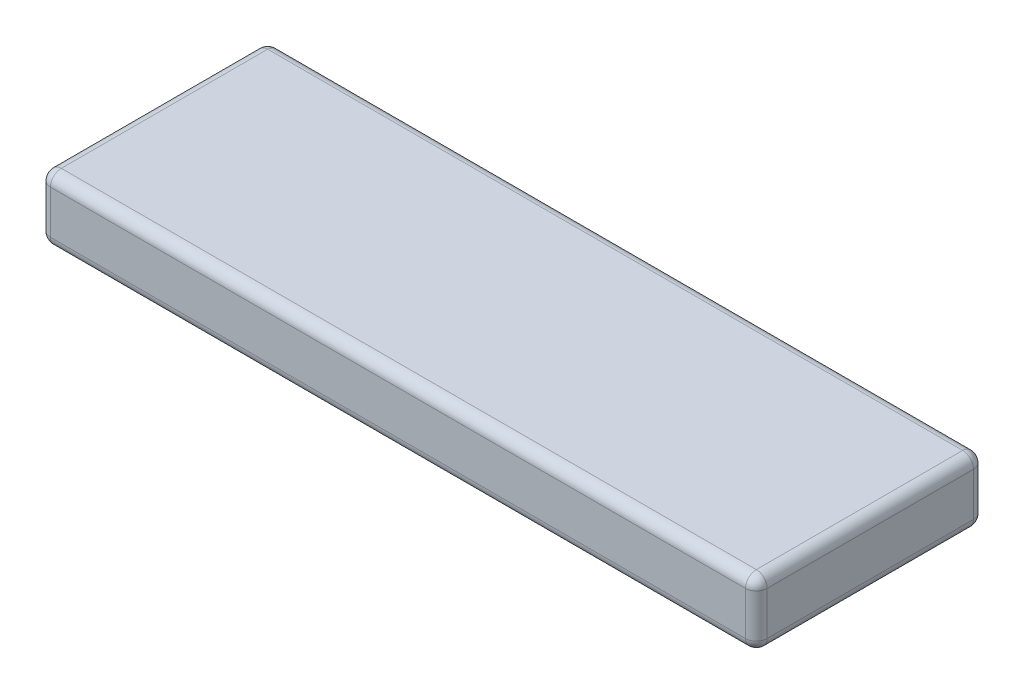
ISO-10303-21;
HEADER;
FILE_DESCRIPTION(('STEP AP214'),'2;1');
FILE_NAME('part.step','',(''),(''),'','','');
FILE_SCHEMA(('AUTOMOTIVE_DESIGN { 1 0 10303 214 1 1 1 1 }'));
ENDSEC;
DATA;
#1=APPLICATION_CONTEXT('core data for automotive mechanical design processes');
#2=APPLICATION_PROTOCOL_DEFINITION('international standard','automotive_design',2000,#1);
#3=PRODUCT_CONTEXT('',#1,'mechanical');
#4=PRODUCT('Part','Part','',(#3));
#5=PRODUCT_RELATED_PRODUCT_CATEGORY('part','',(#4));
#6=PRODUCT_DEFINITION_FORMATION('','',#4);
#7=PRODUCT_DEFINITION_CONTEXT('part definition',#1,'design');
#8=PRODUCT_DEFINITION('design','',#6,#7);
#9=PRODUCT_DEFINITION_SHAPE('','',#8);
#10=(LENGTH_UNIT() NAMED_UNIT(*) SI_UNIT(.MILLI.,.METRE.));
#11=(NAMED_UNIT(*) PLANE_ANGLE_UNIT() SI_UNIT($,.RADIAN.));
#12=(NAMED_UNIT(*) SI_UNIT($,.STERADIAN.) SOLID_ANGLE_UNIT());
#13=UNCERTAINTY_MEASURE_WITH_UNIT(LENGTH_MEASURE(1.E-05),#10,'distance_accuracy_value','');
#14=(GEOMETRIC_REPRESENTATION_CONTEXT(3) GLOBAL_UNCERTAINTY_ASSIGNED_CONTEXT((#13)) GLOBAL_UNIT_ASSIGNED_CONTEXT((#10,
#11,#12)) REPRESENTATION_CONTEXT('',''));
#15=CARTESIAN_POINT('',(0.,0.,0.));
#16=DIRECTION('',(0.,0.,1.));
#17=DIRECTION('',(1.,0.,0.));
#18=AXIS2_PLACEMENT_3D('',#15,#16,#17);
#19=CARTESIAN_POINT('',(66.,12.,21.));
#20=DIRECTION('',(-1.,0.,0.));
#21=DIRECTION('',(0.,0.,1.));
#22=AXIS2_PLACEMENT_3D('',#19,#20,#21);
#23=PLANE('',#22);
#24=DIRECTION('',(0.,-1.,0.));
#25=VECTOR('',#24,1.);
#26=CARTESIAN_POINT('',(66.,12.,19.));
#27=LINE('',#26,#25);
#28=CARTESIAN_POINT('',(66.,10.,19.));
#29=VERTEX_POINT('',#28);
#30=CARTESIAN_POINT('',(66.,2.,19.));
#31=VERTEX_POINT('',#30);
#32=EDGE_CURVE('E281',#29,#31,#27,.T.);
#33=ORIENTED_EDGE('',*,*,#32,.T.);
#34=DIRECTION('',(0.,0.,-1.));
#35=VECTOR('',#34,1.);
#36=CARTESIAN_POINT('',(66.,2.,-21.));
#37=LINE('',#36,#35);
#38=CARTESIAN_POINT('',(66.,2.,-19.));
#39=VERTEX_POINT('',#38);
#40=EDGE_CURVE('E284',#31,#39,#37,.T.);
#41=ORIENTED_EDGE('',*,*,#40,.T.);
#42=DIRECTION('',(0.,-1.,0.));
#43=VECTOR('',#42,1.);
#44=CARTESIAN_POINT('',(66.,12.,-19.));
#45=LINE('',#44,#43);
#46=CARTESIAN_POINT('',(66.,10.,-19.));
#47=VERTEX_POINT('',#46);
#48=EDGE_CURVE('E216',#39,#47,#45,.F.);
#49=ORIENTED_EDGE('',*,*,#48,.T.);
#50=DIRECTION('',(0.,0.,-1.));
#51=VECTOR('',#50,1.);
#52=CARTESIAN_POINT('',(66.,10.,21.));
#53=LINE('',#52,#51);
#54=EDGE_CURVE('E265',#47,#29,#53,.F.);
#55=ORIENTED_EDGE('',*,*,#54,.T.);
#56=EDGE_LOOP('',(#33,#41,#49,#55));
#57=FACE_BOUND('',#56,.T.);
#58=ADVANCED_FACE('F36',(#57),#23,.F.);
#59=CARTESIAN_POINT('',(-66.,12.,-21.));
#60=DIRECTION('',(0.,0.,1.));
#61=DIRECTION('',(1.,0.,0.));
#62=AXIS2_PLACEMENT_3D('',#59,#60,#61);
#63=PLANE('',#62);
#64=DIRECTION('',(0.,-1.,0.));
#65=VECTOR('',#64,1.);
#66=CARTESIAN_POINT('',(64.,12.,-21.));
#67=LINE('',#66,#65);
#68=CARTESIAN_POINT('',(64.,10.,-21.));
#69=VERTEX_POINT('',#68);
#70=CARTESIAN_POINT('',(64.,2.,-21.));
#71=VERTEX_POINT('',#70);
#72=EDGE_CURVE('E219',#69,#71,#67,.T.);
#73=ORIENTED_EDGE('',*,*,#72,.T.);
#74=DIRECTION('',(-1.,0.,0.));
#75=VECTOR('',#74,1.);
#76=CARTESIAN_POINT('',(-66.,2.,-21.));
#77=LINE('',#76,#75);
#78=CARTESIAN_POINT('',(-64.,2.,-21.));
#79=VERTEX_POINT('',#78);
#80=EDGE_CURVE('E221',#71,#79,#77,.T.);
#81=ORIENTED_EDGE('',*,*,#80,.T.);
#82=DIRECTION('',(0.,-1.,0.));
#83=VECTOR('',#82,1.);
#84=CARTESIAN_POINT('',(-64.,12.,-21.));
#85=LINE('',#84,#83);
#86=CARTESIAN_POINT('',(-64.,10.,-21.));
#87=VERTEX_POINT('',#86);
#88=EDGE_CURVE('E222',#79,#87,#85,.F.);
#89=ORIENTED_EDGE('',*,*,#88,.T.);
#90=DIRECTION('',(-1.,0.,0.));
#91=VECTOR('',#90,1.);
#92=CARTESIAN_POINT('',(-66.,10.,-21.));
#93=LINE('',#92,#91);
#94=EDGE_CURVE('E226',#87,#69,#93,.F.);
#95=ORIENTED_EDGE('',*,*,#94,.T.);
#96=EDGE_LOOP('',(#73,#81,#89,#95));
#97=FACE_BOUND('',#96,.T.);
#98=ADVANCED_FACE('F286',(#97),#63,.F.);
#99=CARTESIAN_POINT('',(-66.,12.,21.));
#100=DIRECTION('',(1.,0.,0.));
#101=DIRECTION('',(0.,0.,-1.));
#102=AXIS2_PLACEMENT_3D('',#99,#100,#101);
#103=PLANE('',#102);
#104=DIRECTION('',(0.,-1.,0.));
#105=VECTOR('',#104,1.);
#106=CARTESIAN_POINT('',(-66.,12.,-19.));
#107=LINE('',#106,#105);
#108=CARTESIAN_POINT('',(-66.,10.,-19.));
#109=VERTEX_POINT('',#108);
#110=CARTESIAN_POINT('',(-66.,2.,-19.));
#111=VERTEX_POINT('',#110);
#112=EDGE_CURVE('E134',#109,#111,#107,.T.);
#113=ORIENTED_EDGE('',*,*,#112,.T.);
#114=DIRECTION('',(0.,0.,1.));
#115=VECTOR('',#114,1.);
#116=CARTESIAN_POINT('',(-66.,2.,21.));
#117=LINE('',#116,#115);
#118=CARTESIAN_POINT('',(-66.,2.,19.));
#119=VERTEX_POINT('',#118);
#120=EDGE_CURVE('E130',#111,#119,#117,.T.);
#121=ORIENTED_EDGE('',*,*,#120,.T.);
#122=DIRECTION('',(0.,-1.,0.));
#123=VECTOR('',#122,1.);
#124=CARTESIAN_POINT('',(-66.,12.,19.));
#125=LINE('',#124,#123);
#126=CARTESIAN_POINT('',(-66.,10.,19.));
#127=VERTEX_POINT('',#126);
#128=EDGE_CURVE('E124',#119,#127,#125,.F.);
#129=ORIENTED_EDGE('',*,*,#128,.T.);
#130=DIRECTION('',(0.,0.,1.));
#131=VECTOR('',#130,1.);
#132=CARTESIAN_POINT('',(-66.,10.,21.));
#133=LINE('',#132,#131);
#134=EDGE_CURVE('E127',#127,#109,#133,.F.);
#135=ORIENTED_EDGE('',*,*,#134,.T.);
#136=EDGE_LOOP('',(#113,#121,#129,#135));
#137=FACE_BOUND('',#136,.T.);
#138=ADVANCED_FACE('F126',(#137),#103,.F.);
#139=CARTESIAN_POINT('',(-66.,12.,21.));
#140=DIRECTION('',(0.,0.,-1.));
#141=DIRECTION('',(-1.,0.,0.));
#142=AXIS2_PLACEMENT_3D('',#139,#140,#141);
#143=PLANE('',#142);
#144=DIRECTION('',(0.,-1.,0.));
#145=VECTOR('',#144,1.);
#146=CARTESIAN_POINT('',(-64.,12.,21.));
#147=LINE('',#146,#145);
#148=CARTESIAN_POINT('',(-64.,10.,21.));
#149=VERTEX_POINT('',#148);
#150=CARTESIAN_POINT('',(-64.,2.,21.));
#151=VERTEX_POINT('',#150);
#152=EDGE_CURVE('E156',#149,#151,#147,.T.);
#153=ORIENTED_EDGE('',*,*,#152,.T.);
#154=DIRECTION('',(1.,0.,0.));
#155=VECTOR('',#154,1.);
#156=CARTESIAN_POINT('',(66.,2.,21.));
#157=LINE('',#156,#155);
#158=CARTESIAN_POINT('',(64.,2.,21.));
#159=VERTEX_POINT('',#158);
#160=EDGE_CURVE('E234',#151,#159,#157,.T.);
#161=ORIENTED_EDGE('',*,*,#160,.T.);
#162=DIRECTION('',(0.,-1.,0.));
#163=VECTOR('',#162,1.);
#164=CARTESIAN_POINT('',(64.,12.,21.));
#165=LINE('',#164,#163);
#166=CARTESIAN_POINT('',(64.,10.,21.));
#167=VERTEX_POINT('',#166);
#168=EDGE_CURVE('E231',#159,#167,#165,.F.);
#169=ORIENTED_EDGE('',*,*,#168,.T.);
#170=DIRECTION('',(1.,0.,0.));
#171=VECTOR('',#170,1.);
#172=CARTESIAN_POINT('',(-66.,10.,21.));
#173=LINE('',#172,#171);
#174=EDGE_CURVE('E224',#167,#149,#173,.F.);
#175=ORIENTED_EDGE('',*,*,#174,.T.);
#176=EDGE_LOOP('',(#153,#161,#169,#175));
#177=FACE_BOUND('',#176,.T.);
#178=ADVANCED_FACE('F340',(#177),#143,.F.);
#179=CARTESIAN_POINT('',(0.,12.,0.));
#180=DIRECTION('',(0.,-1.,0.));
#181=DIRECTION('',(0.,0.,-1.));
#182=AXIS2_PLACEMENT_3D('',#179,#180,#181);
#183=PLANE('',#182);
#184=DIRECTION('',(0.,0.,1.));
#185=VECTOR('',#184,1.);
#186=CARTESIAN_POINT('',(-64.,12.,0.));
#187=LINE('',#186,#185);
#188=CARTESIAN_POINT('',(-64.,12.,-19.));
#189=VERTEX_POINT('',#188);
#190=CARTESIAN_POINT('',(-64.,12.,19.));
#191=VERTEX_POINT('',#190);
#192=EDGE_CURVE('E45',#189,#191,#187,.T.);
#193=ORIENTED_EDGE('',*,*,#192,.T.);
#194=DIRECTION('',(1.,0.,0.));
#195=VECTOR('',#194,1.);
#196=CARTESIAN_POINT('',(0.,12.,19.));
#197=LINE('',#196,#195);
#198=CARTESIAN_POINT('',(64.,12.,19.));
#199=VERTEX_POINT('',#198);
#200=EDGE_CURVE('E11',#191,#199,#197,.T.);
#201=ORIENTED_EDGE('',*,*,#200,.T.);
#202=DIRECTION('',(0.,0.,-1.));
#203=VECTOR('',#202,1.);
#204=CARTESIAN_POINT('',(64.,12.,0.));
#205=LINE('',#204,#203);
#206=CARTESIAN_POINT('',(64.,12.,-19.));
#207=VERTEX_POINT('',#206);
#208=EDGE_CURVE('E236',#199,#207,#205,.T.);
#209=ORIENTED_EDGE('',*,*,#208,.T.);
#210=DIRECTION('',(-1.,0.,0.));
#211=VECTOR('',#210,1.);
#212=CARTESIAN_POINT('',(0.,12.,-19.));
#213=LINE('',#212,#211);
#214=EDGE_CURVE('E56',#207,#189,#213,.T.);
#215=ORIENTED_EDGE('',*,*,#214,.T.);
#216=EDGE_LOOP('',(#193,#201,#209,#215));
#217=FACE_BOUND('',#216,.T.);
#218=ADVANCED_FACE('F344',(#217),#183,.F.);
#219=CARTESIAN_POINT('',(0.,0.,0.));
#220=DIRECTION('',(0.,-1.,0.));
#221=DIRECTION('',(0.,0.,-1.));
#222=AXIS2_PLACEMENT_3D('',#219,#220,#221);
#223=PLANE('',#222);
#224=DIRECTION('',(0.,0.,1.));
#225=VECTOR('',#224,1.);
#226=CARTESIAN_POINT('',(-64.,0.,-21.));
#227=LINE('',#226,#225);
#228=CARTESIAN_POINT('',(-64.,0.,19.));
#229=VERTEX_POINT('',#228);
#230=CARTESIAN_POINT('',(-64.,0.,-19.));
#231=VERTEX_POINT('',#230);
#232=EDGE_CURVE('E266',#229,#231,#227,.F.);
#233=ORIENTED_EDGE('',*,*,#232,.T.);
#234=DIRECTION('',(-1.,0.,0.));
#235=VECTOR('',#234,1.);
#236=CARTESIAN_POINT('',(66.,0.,-19.));
#237=LINE('',#236,#235);
#238=CARTESIAN_POINT('',(64.,0.,-19.));
#239=VERTEX_POINT('',#238);
#240=EDGE_CURVE('E259',#231,#239,#237,.F.);
#241=ORIENTED_EDGE('',*,*,#240,.T.);
#242=DIRECTION('',(0.,0.,-1.));
#243=VECTOR('',#242,1.);
#244=CARTESIAN_POINT('',(64.,0.,21.));
#245=LINE('',#244,#243);
#246=CARTESIAN_POINT('',(64.,0.,19.));
#247=VERTEX_POINT('',#246);
#248=EDGE_CURVE('E275',#239,#247,#245,.F.);
#249=ORIENTED_EDGE('',*,*,#248,.T.);
#250=DIRECTION('',(1.,0.,0.));
#251=VECTOR('',#250,1.);
#252=CARTESIAN_POINT('',(-66.,0.,19.));
#253=LINE('',#252,#251);
#254=EDGE_CURVE('E271',#247,#229,#253,.F.);
#255=ORIENTED_EDGE('',*,*,#254,.T.);
#256=EDGE_LOOP('',(#233,#241,#249,#255));
#257=FACE_BOUND('',#256,.T.);
#258=ADVANCED_FACE('F269',(#257),#223,.T.);
#259=CARTESIAN_POINT('',(64.,10.,0.));
#260=DIRECTION('',(0.,0.,-1.));
#261=DIRECTION('',(-1.,0.,0.));
#262=AXIS2_PLACEMENT_3D('',#259,#260,#261);
#263=CYLINDRICAL_SURFACE('',#262,2.);
#264=CARTESIAN_POINT('',(64.,10.,-19.));
#265=DIRECTION('',(0.,0.,-1.));
#266=DIRECTION('',(-1.,0.,0.));
#267=AXIS2_PLACEMENT_3D('',#264,#265,#266);
#268=CIRCLE('',#267,2.);
#269=EDGE_CURVE('E40',#207,#47,#268,.T.);
#270=ORIENTED_EDGE('',*,*,#269,.F.);
#271=ORIENTED_EDGE('',*,*,#208,.F.);
#272=CARTESIAN_POINT('',(64.,10.,19.));
#273=DIRECTION('',(0.,0.,1.));
#274=DIRECTION('',(1.,0.,0.));
#275=AXIS2_PLACEMENT_3D('',#272,#273,#274);
#276=CIRCLE('',#275,2.);
#277=EDGE_CURVE('E196',#29,#199,#276,.T.);
#278=ORIENTED_EDGE('',*,*,#277,.F.);
#279=ORIENTED_EDGE('',*,*,#54,.F.);
#280=EDGE_LOOP('',(#270,#271,#278,#279));
#281=FACE_BOUND('',#280,.T.);
#282=ADVANCED_FACE('F38',(#281),#263,.T.);
#283=CARTESIAN_POINT('',(64.,10.,-19.));
#284=DIRECTION('',(1.,0.,0.));
#285=DIRECTION('',(0.,0.,-1.));
#286=AXIS2_PLACEMENT_3D('',#283,#284,#285);
#287=SPHERICAL_SURFACE('',#286,2.);
#288=CARTESIAN_POINT('',(64.,10.,-19.));
#289=DIRECTION('',(1.,0.,0.));
#290=DIRECTION('',(0.,0.,-1.));
#291=AXIS2_PLACEMENT_3D('',#288,#289,#290);
#292=CIRCLE('',#291,2.);
#293=EDGE_CURVE('E191',#207,#69,#292,.F.);
#294=ORIENTED_EDGE('',*,*,#293,.F.);
#295=ORIENTED_EDGE('',*,*,#269,.T.);
#296=CARTESIAN_POINT('',(64.,10.,-19.));
#297=DIRECTION('',(0.,1.,0.));
#298=DIRECTION('',(0.,0.,1.));
#299=AXIS2_PLACEMENT_3D('',#296,#297,#298);
#300=CIRCLE('',#299,2.);
#301=EDGE_CURVE('E194',#69,#47,#300,.F.);
#302=ORIENTED_EDGE('',*,*,#301,.F.);
#303=EDGE_LOOP('',(#294,#295,#302));
#304=FACE_BOUND('',#303,.T.);
#305=ADVANCED_FACE('F208',(#304),#287,.T.);
#306=CARTESIAN_POINT('',(64.,10.,19.));
#307=DIRECTION('',(0.,1.,0.));
#308=DIRECTION('',(0.,0.,1.));
#309=AXIS2_PLACEMENT_3D('',#306,#307,#308);
#310=SPHERICAL_SURFACE('',#309,2.);
#311=CARTESIAN_POINT('',(64.,10.,19.));
#312=DIRECTION('',(0.,1.,0.));
#313=DIRECTION('',(0.,0.,1.));
#314=AXIS2_PLACEMENT_3D('',#311,#312,#313);
#315=CIRCLE('',#314,2.);
#316=EDGE_CURVE('E186',#29,#167,#315,.F.);
#317=ORIENTED_EDGE('',*,*,#316,.F.);
#318=ORIENTED_EDGE('',*,*,#277,.T.);
#319=CARTESIAN_POINT('',(64.,10.,19.));
#320=DIRECTION('',(1.,0.,0.));
#321=DIRECTION('',(0.,0.,-1.));
#322=AXIS2_PLACEMENT_3D('',#319,#320,#321);
#323=CIRCLE('',#322,2.);
#324=EDGE_CURVE('E189',#167,#199,#323,.F.);
#325=ORIENTED_EDGE('',*,*,#324,.F.);
#326=EDGE_LOOP('',(#317,#318,#325));
#327=FACE_BOUND('',#326,.T.);
#328=ADVANCED_FACE('F345',(#327),#310,.T.);
#329=CARTESIAN_POINT('',(64.,12.,-19.));
#330=DIRECTION('',(0.,-1.,0.));
#331=DIRECTION('',(0.,0.,-1.));
#332=AXIS2_PLACEMENT_3D('',#329,#330,#331);
#333=CYLINDRICAL_SURFACE('',#332,2.);
#334=ORIENTED_EDGE('',*,*,#301,.T.);
#335=ORIENTED_EDGE('',*,*,#48,.F.);
#336=CARTESIAN_POINT('',(64.,2.,-19.));
#337=DIRECTION('',(0.,-1.,0.));
#338=DIRECTION('',(0.,0.,-1.));
#339=AXIS2_PLACEMENT_3D('',#336,#337,#338);
#340=CIRCLE('',#339,2.);
#341=EDGE_CURVE('E181',#71,#39,#340,.T.);
#342=ORIENTED_EDGE('',*,*,#341,.F.);
#343=ORIENTED_EDGE('',*,*,#72,.F.);
#344=EDGE_LOOP('',(#334,#335,#342,#343));
#345=FACE_BOUND('',#344,.T.);
#346=ADVANCED_FACE('F214',(#345),#333,.T.);
#347=CARTESIAN_POINT('',(0.,10.,-19.));
#348=DIRECTION('',(-1.,0.,0.));
#349=DIRECTION('',(0.,0.,1.));
#350=AXIS2_PLACEMENT_3D('',#347,#348,#349);
#351=CYLINDRICAL_SURFACE('',#350,2.);
#352=ORIENTED_EDGE('',*,*,#293,.T.);
#353=ORIENTED_EDGE('',*,*,#94,.F.);
#354=CARTESIAN_POINT('',(-64.,10.,-19.));
#355=DIRECTION('',(-1.,0.,0.));
#356=DIRECTION('',(0.,0.,1.));
#357=AXIS2_PLACEMENT_3D('',#354,#355,#356);
#358=CIRCLE('',#357,2.);
#359=EDGE_CURVE('E178',#189,#87,#358,.T.);
#360=ORIENTED_EDGE('',*,*,#359,.F.);
#361=ORIENTED_EDGE('',*,*,#214,.F.);
#362=EDGE_LOOP('',(#352,#353,#360,#361));
#363=FACE_BOUND('',#362,.T.);
#364=ADVANCED_FACE('F290',(#363),#351,.T.);
#365=CARTESIAN_POINT('',(-64.,10.,0.));
#366=DIRECTION('',(0.,0.,1.));
#367=DIRECTION('',(1.,0.,0.));
#368=AXIS2_PLACEMENT_3D('',#365,#366,#367);
#369=CYLINDRICAL_SURFACE('',#368,2.);
#370=CARTESIAN_POINT('',(-64.,10.,19.));
#371=DIRECTION('',(0.,0.,1.));
#372=DIRECTION('',(1.,0.,0.));
#373=AXIS2_PLACEMENT_3D('',#370,#371,#372);
#374=CIRCLE('',#373,2.);
#375=EDGE_CURVE('E140',#191,#127,#374,.T.);
#376=ORIENTED_EDGE('',*,*,#375,.F.);
#377=ORIENTED_EDGE('',*,*,#192,.F.);
#378=CARTESIAN_POINT('',(-64.,10.,-19.));
#379=DIRECTION('',(0.,0.,-1.));
#380=DIRECTION('',(0.,1.,0.));
#381=AXIS2_PLACEMENT_3D('',#378,#379,#380);
#382=CIRCLE('',#381,2.);
#383=EDGE_CURVE('E143',#109,#189,#382,.T.);
#384=ORIENTED_EDGE('',*,*,#383,.F.);
#385=ORIENTED_EDGE('',*,*,#134,.F.);
#386=EDGE_LOOP('',(#376,#377,#384,#385));
#387=FACE_BOUND('',#386,.T.);
#388=ADVANCED_FACE('F139',(#387),#369,.T.);
#389=CARTESIAN_POINT('',(0.,10.,19.));
#390=DIRECTION('',(1.,0.,0.));
#391=DIRECTION('',(0.,0.,-1.));
#392=AXIS2_PLACEMENT_3D('',#389,#390,#391);
#393=CYLINDRICAL_SURFACE('',#392,2.);
#394=ORIENTED_EDGE('',*,*,#324,.T.);
#395=ORIENTED_EDGE('',*,*,#200,.F.);
#396=CARTESIAN_POINT('',(-64.,10.,19.));
#397=DIRECTION('',(-1.,0.,0.));
#398=DIRECTION('',(0.,0.,1.));
#399=AXIS2_PLACEMENT_3D('',#396,#397,#398);
#400=CIRCLE('',#399,2.);
#401=EDGE_CURVE('E152',#149,#191,#400,.T.);
#402=ORIENTED_EDGE('',*,*,#401,.F.);
#403=ORIENTED_EDGE('',*,*,#174,.F.);
#404=EDGE_LOOP('',(#394,#395,#402,#403));
#405=FACE_BOUND('',#404,.T.);
#406=ADVANCED_FACE('F343',(#405),#393,.T.);
#407=CARTESIAN_POINT('',(64.,12.,19.));
#408=DIRECTION('',(0.,-1.,0.));
#409=DIRECTION('',(0.,0.,-1.));
#410=AXIS2_PLACEMENT_3D('',#407,#408,#409);
#411=CYLINDRICAL_SURFACE('',#410,2.);
#412=ORIENTED_EDGE('',*,*,#316,.T.);
#413=ORIENTED_EDGE('',*,*,#168,.F.);
#414=CARTESIAN_POINT('',(64.,2.,19.));
#415=DIRECTION('',(0.,-1.,0.));
#416=DIRECTION('',(0.,0.,-1.));
#417=AXIS2_PLACEMENT_3D('',#414,#415,#416);
#418=CIRCLE('',#417,2.);
#419=EDGE_CURVE('E173',#31,#159,#418,.T.);
#420=ORIENTED_EDGE('',*,*,#419,.F.);
#421=ORIENTED_EDGE('',*,*,#32,.F.);
#422=EDGE_LOOP('',(#412,#413,#420,#421));
#423=FACE_BOUND('',#422,.T.);
#424=ADVANCED_FACE('F338',(#423),#411,.T.);
#425=CARTESIAN_POINT('',(64.,2.,21.));
#426=DIRECTION('',(0.,0.,1.));
#427=DIRECTION('',(1.,0.,0.));
#428=AXIS2_PLACEMENT_3D('',#425,#426,#427);
#429=CYLINDRICAL_SURFACE('',#428,2.);
#430=CARTESIAN_POINT('',(64.,2.,-19.));
#431=DIRECTION('',(0.,0.,-1.));
#432=DIRECTION('',(-1.,0.,0.));
#433=AXIS2_PLACEMENT_3D('',#430,#431,#432);
#434=CIRCLE('',#433,2.);
#435=EDGE_CURVE('E183',#39,#239,#434,.T.);
#436=ORIENTED_EDGE('',*,*,#435,.F.);
#437=ORIENTED_EDGE('',*,*,#40,.F.);
#438=CARTESIAN_POINT('',(64.,2.,19.));
#439=DIRECTION('',(0.,0.,1.));
#440=DIRECTION('',(1.,0.,0.));
#441=AXIS2_PLACEMENT_3D('',#438,#439,#440);
#442=CIRCLE('',#441,2.);
#443=EDGE_CURVE('E170',#247,#31,#442,.T.);
#444=ORIENTED_EDGE('',*,*,#443,.F.);
#445=ORIENTED_EDGE('',*,*,#248,.F.);
#446=EDGE_LOOP('',(#436,#437,#444,#445));
#447=FACE_BOUND('',#446,.T.);
#448=ADVANCED_FACE('F362',(#447),#429,.T.);
#449=CARTESIAN_POINT('',(64.,2.,-19.));
#450=DIRECTION('',(1.,0.,0.));
#451=DIRECTION('',(0.,0.,-1.));
#452=AXIS2_PLACEMENT_3D('',#449,#450,#451);
#453=SPHERICAL_SURFACE('',#452,2.);
#454=ORIENTED_EDGE('',*,*,#341,.T.);
#455=ORIENTED_EDGE('',*,*,#435,.T.);
#456=CARTESIAN_POINT('',(64.,2.,-19.));
#457=DIRECTION('',(1.,0.,0.));
#458=DIRECTION('',(0.,0.,-1.));
#459=AXIS2_PLACEMENT_3D('',#456,#457,#458);
#460=CIRCLE('',#459,2.);
#461=EDGE_CURVE('E161',#71,#239,#460,.F.);
#462=ORIENTED_EDGE('',*,*,#461,.F.);
#463=EDGE_LOOP('',(#454,#455,#462));
#464=FACE_BOUND('',#463,.T.);
#465=ADVANCED_FACE('F365',(#464),#453,.T.);
#466=CARTESIAN_POINT('',(-64.,10.,-19.));
#467=DIRECTION('',(0.,1.,0.));
#468=DIRECTION('',(0.,0.,1.));
#469=AXIS2_PLACEMENT_3D('',#466,#467,#468);
#470=SPHERICAL_SURFACE('',#469,2.);
#471=ORIENTED_EDGE('',*,*,#383,.T.);
#472=ORIENTED_EDGE('',*,*,#359,.T.);
#473=CARTESIAN_POINT('',(-64.,10.,-19.));
#474=DIRECTION('',(0.,1.,0.));
#475=DIRECTION('',(0.,0.,1.));
#476=AXIS2_PLACEMENT_3D('',#473,#474,#475);
#477=CIRCLE('',#476,2.);
#478=EDGE_CURVE('E157',#109,#87,#477,.F.);
#479=ORIENTED_EDGE('',*,*,#478,.F.);
#480=EDGE_LOOP('',(#471,#472,#479));
#481=FACE_BOUND('',#480,.T.);
#482=ADVANCED_FACE('F292',(#481),#470,.T.);
#483=CARTESIAN_POINT('',(-64.,10.,19.));
#484=DIRECTION('',(0.,1.,0.));
#485=DIRECTION('',(0.,0.,1.));
#486=AXIS2_PLACEMENT_3D('',#483,#484,#485);
#487=SPHERICAL_SURFACE('',#486,2.);
#488=ORIENTED_EDGE('',*,*,#401,.T.);
#489=ORIENTED_EDGE('',*,*,#375,.T.);
#490=CARTESIAN_POINT('',(-64.,10.,19.));
#491=DIRECTION('',(0.,1.,0.));
#492=DIRECTION('',(0.,0.,1.));
#493=AXIS2_PLACEMENT_3D('',#490,#491,#492);
#494=CIRCLE('',#493,2.);
#495=EDGE_CURVE('E149',#149,#127,#494,.F.);
#496=ORIENTED_EDGE('',*,*,#495,.F.);
#497=EDGE_LOOP('',(#488,#489,#496));
#498=FACE_BOUND('',#497,.T.);
#499=ADVANCED_FACE('F148',(#498),#487,.T.);
#500=CARTESIAN_POINT('',(64.,2.,19.));
#501=DIRECTION('',(1.,0.,0.));
#502=DIRECTION('',(0.,0.,-1.));
#503=AXIS2_PLACEMENT_3D('',#500,#501,#502);
#504=SPHERICAL_SURFACE('',#503,2.);
#505=ORIENTED_EDGE('',*,*,#443,.T.);
#506=ORIENTED_EDGE('',*,*,#419,.T.);
#507=CARTESIAN_POINT('',(64.,2.,19.));
#508=DIRECTION('',(1.,0.,0.));
#509=DIRECTION('',(0.,0.,-1.));
#510=AXIS2_PLACEMENT_3D('',#507,#508,#509);
#511=CIRCLE('',#510,2.);
#512=EDGE_CURVE('E158',#247,#159,#511,.F.);
#513=ORIENTED_EDGE('',*,*,#512,.F.);
#514=EDGE_LOOP('',(#505,#506,#513));
#515=FACE_BOUND('',#514,.T.);
#516=ADVANCED_FACE('F306',(#515),#504,.T.);
#517=CARTESIAN_POINT('',(-66.,2.,-19.));
#518=DIRECTION('',(1.,0.,0.));
#519=DIRECTION('',(0.,0.,-1.));
#520=AXIS2_PLACEMENT_3D('',#517,#518,#519);
#521=CYLINDRICAL_SURFACE('',#520,2.);
#522=ORIENTED_EDGE('',*,*,#461,.T.);
#523=ORIENTED_EDGE('',*,*,#240,.F.);
#524=CARTESIAN_POINT('',(-64.,2.,-19.));
#525=DIRECTION('',(-1.,0.,0.));
#526=DIRECTION('',(0.,0.,1.));
#527=AXIS2_PLACEMENT_3D('',#524,#525,#526);
#528=CIRCLE('',#527,2.);
#529=EDGE_CURVE('E164',#79,#231,#528,.T.);
#530=ORIENTED_EDGE('',*,*,#529,.F.);
#531=ORIENTED_EDGE('',*,*,#80,.F.);
#532=EDGE_LOOP('',(#522,#523,#530,#531));
#533=FACE_BOUND('',#532,.T.);
#534=ADVANCED_FACE('F261',(#533),#521,.T.);
#535=CARTESIAN_POINT('',(-64.,12.,-19.));
#536=DIRECTION('',(0.,-1.,0.));
#537=DIRECTION('',(0.,0.,-1.));
#538=AXIS2_PLACEMENT_3D('',#535,#536,#537);
#539=CYLINDRICAL_SURFACE('',#538,2.);
#540=ORIENTED_EDGE('',*,*,#478,.T.);
#541=ORIENTED_EDGE('',*,*,#88,.F.);
#542=CARTESIAN_POINT('',(-64.,2.,-19.));
#543=DIRECTION('',(0.,-1.,0.));
#544=DIRECTION('',(0.,0.,-1.));
#545=AXIS2_PLACEMENT_3D('',#542,#543,#544);
#546=CIRCLE('',#545,2.);
#547=EDGE_CURVE('E249',#111,#79,#546,.T.);
#548=ORIENTED_EDGE('',*,*,#547,.F.);
#549=ORIENTED_EDGE('',*,*,#112,.F.);
#550=EDGE_LOOP('',(#540,#541,#548,#549));
#551=FACE_BOUND('',#550,.T.);
#552=ADVANCED_FACE('F295',(#551),#539,.T.);
#553=CARTESIAN_POINT('',(-64.,12.,19.));
#554=DIRECTION('',(0.,-1.,0.));
#555=DIRECTION('',(0.,0.,-1.));
#556=AXIS2_PLACEMENT_3D('',#553,#554,#555);
#557=CYLINDRICAL_SURFACE('',#556,2.);
#558=ORIENTED_EDGE('',*,*,#495,.T.);
#559=ORIENTED_EDGE('',*,*,#128,.F.);
#560=CARTESIAN_POINT('',(-64.,2.,19.));
#561=DIRECTION('',(0.,-1.,0.));
#562=DIRECTION('',(0.,0.,-1.));
#563=AXIS2_PLACEMENT_3D('',#560,#561,#562);
#564=CIRCLE('',#563,2.);
#565=EDGE_CURVE('E246',#151,#119,#564,.T.);
#566=ORIENTED_EDGE('',*,*,#565,.F.);
#567=ORIENTED_EDGE('',*,*,#152,.F.);
#568=EDGE_LOOP('',(#558,#559,#566,#567));
#569=FACE_BOUND('',#568,.T.);
#570=ADVANCED_FACE('F154',(#569),#557,.T.);
#571=CARTESIAN_POINT('',(-66.,2.,19.));
#572=DIRECTION('',(-1.,0.,0.));
#573=DIRECTION('',(0.,0.,1.));
#574=AXIS2_PLACEMENT_3D('',#571,#572,#573);
#575=CYLINDRICAL_SURFACE('',#574,2.);
#576=ORIENTED_EDGE('',*,*,#512,.T.);
#577=ORIENTED_EDGE('',*,*,#160,.F.);
#578=CARTESIAN_POINT('',(-64.,2.,19.));
#579=DIRECTION('',(-1.,0.,0.));
#580=DIRECTION('',(0.,0.,1.));
#581=AXIS2_PLACEMENT_3D('',#578,#579,#580);
#582=CIRCLE('',#581,2.);
#583=EDGE_CURVE('E244',#229,#151,#582,.T.);
#584=ORIENTED_EDGE('',*,*,#583,.F.);
#585=ORIENTED_EDGE('',*,*,#254,.F.);
#586=EDGE_LOOP('',(#576,#577,#584,#585));
#587=FACE_BOUND('',#586,.T.);
#588=ADVANCED_FACE('F304',(#587),#575,.T.);
#589=CARTESIAN_POINT('',(-64.,2.,-19.));
#590=DIRECTION('',(0.,0.,-1.));
#591=DIRECTION('',(-1.,0.,0.));
#592=AXIS2_PLACEMENT_3D('',#589,#590,#591);
#593=SPHERICAL_SURFACE('',#592,2.);
#594=ORIENTED_EDGE('',*,*,#547,.T.);
#595=ORIENTED_EDGE('',*,*,#529,.T.);
#596=CARTESIAN_POINT('',(-64.,2.,-19.));
#597=DIRECTION('',(0.,0.,-1.));
#598=DIRECTION('',(-1.,0.,0.));
#599=AXIS2_PLACEMENT_3D('',#596,#597,#598);
#600=CIRCLE('',#599,2.);
#601=EDGE_CURVE('E242',#111,#231,#600,.F.);
#602=ORIENTED_EDGE('',*,*,#601,.F.);
#603=EDGE_LOOP('',(#594,#595,#602));
#604=FACE_BOUND('',#603,.T.);
#605=ADVANCED_FACE('F256',(#604),#593,.T.);
#606=CARTESIAN_POINT('',(-64.,2.,19.));
#607=DIRECTION('',(0.,0.,1.));
#608=DIRECTION('',(1.,0.,0.));
#609=AXIS2_PLACEMENT_3D('',#606,#607,#608);
#610=SPHERICAL_SURFACE('',#609,2.);
#611=ORIENTED_EDGE('',*,*,#583,.T.);
#612=ORIENTED_EDGE('',*,*,#565,.T.);
#613=CARTESIAN_POINT('',(-64.,2.,19.));
#614=DIRECTION('',(0.,0.,1.));
#615=DIRECTION('',(1.,0.,0.));
#616=AXIS2_PLACEMENT_3D('',#613,#614,#615);
#617=CIRCLE('',#616,2.);
#618=EDGE_CURVE('E240',#229,#119,#617,.F.);
#619=ORIENTED_EDGE('',*,*,#618,.F.);
#620=EDGE_LOOP('',(#611,#612,#619));
#621=FACE_BOUND('',#620,.T.);
#622=ADVANCED_FACE('F320',(#621),#610,.T.);
#623=CARTESIAN_POINT('',(-64.,2.,21.));
#624=DIRECTION('',(0.,0.,-1.));
#625=DIRECTION('',(-1.,0.,0.));
#626=AXIS2_PLACEMENT_3D('',#623,#624,#625);
#627=CYLINDRICAL_SURFACE('',#626,2.);
#628=ORIENTED_EDGE('',*,*,#601,.T.);
#629=ORIENTED_EDGE('',*,*,#232,.F.);
#630=ORIENTED_EDGE('',*,*,#618,.T.);
#631=ORIENTED_EDGE('',*,*,#120,.F.);
#632=EDGE_LOOP('',(#628,#629,#630,#631));
#633=FACE_BOUND('',#632,.T.);
#634=ADVANCED_FACE('F317',(#633),#627,.T.);
#635=CLOSED_SHELL('',(#58,#98,#138,#178,#218,#258,#282,#305,#328,#346,#364,#388,#406,#424,#448,
#465,#482,#499,#516,#534,#552,#570,#588,#605,#622,#634));
#636=MANIFOLD_SOLID_BREP('B2',#635);
#637=ADVANCED_BREP_SHAPE_REPRESENTATION('',(#18,#636),#14);
#638=SHAPE_DEFINITION_REPRESENTATION(#9,#637);
ENDSEC;
END-ISO-10303-21;
